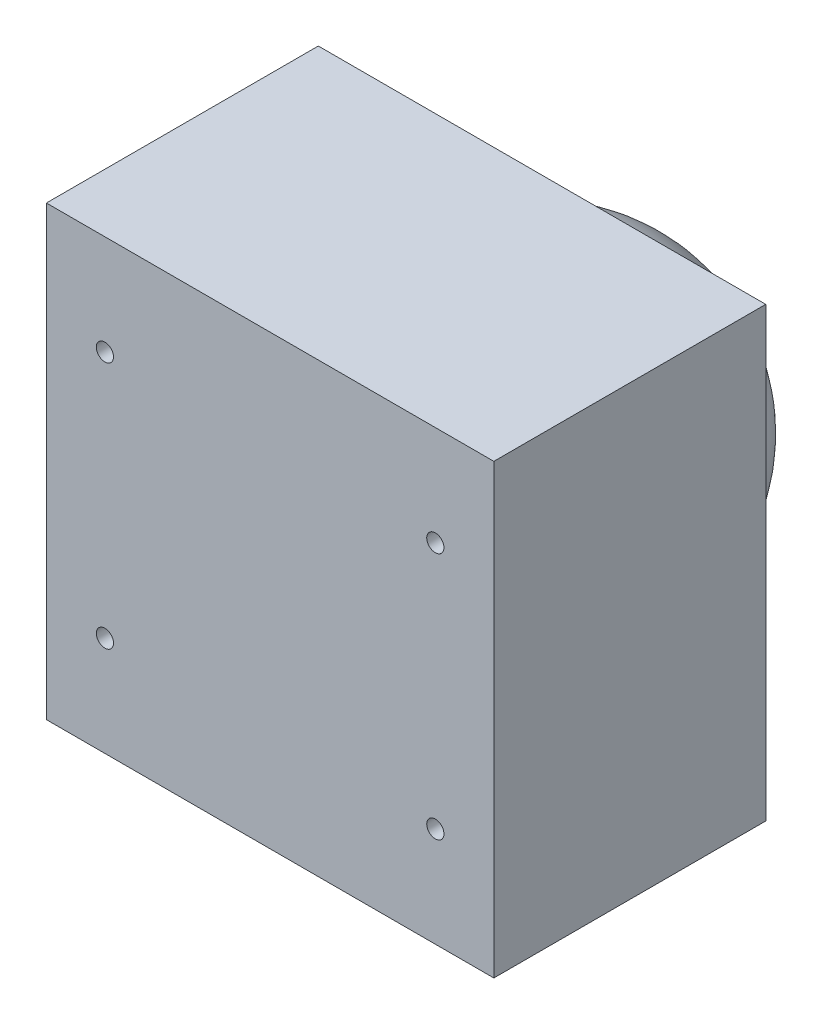
ISO-10303-21;
HEADER;
FILE_DESCRIPTION(('STEP AP214'),'2;1');
FILE_NAME('part.step','',(''),(''),'','','');
FILE_SCHEMA(('AUTOMOTIVE_DESIGN { 1 0 10303 214 1 1 1 1 }'));
ENDSEC;
DATA;
#1=APPLICATION_CONTEXT('core data for automotive mechanical design processes');
#2=APPLICATION_PROTOCOL_DEFINITION('international standard','automotive_design',2000,#1);
#3=PRODUCT_CONTEXT('',#1,'mechanical');
#4=PRODUCT('Part','Part','',(#3));
#5=PRODUCT_RELATED_PRODUCT_CATEGORY('part','',(#4));
#6=PRODUCT_DEFINITION_FORMATION('','',#4);
#7=PRODUCT_DEFINITION_CONTEXT('part definition',#1,'design');
#8=PRODUCT_DEFINITION('design','',#6,#7);
#9=PRODUCT_DEFINITION_SHAPE('','',#8);
#10=(LENGTH_UNIT() NAMED_UNIT(*) SI_UNIT(.MILLI.,.METRE.));
#11=(NAMED_UNIT(*) PLANE_ANGLE_UNIT() SI_UNIT($,.RADIAN.));
#12=(NAMED_UNIT(*) SI_UNIT($,.STERADIAN.) SOLID_ANGLE_UNIT());
#13=UNCERTAINTY_MEASURE_WITH_UNIT(LENGTH_MEASURE(1.E-05),#10,'distance_accuracy_value','');
#14=(GEOMETRIC_REPRESENTATION_CONTEXT(3) GLOBAL_UNCERTAINTY_ASSIGNED_CONTEXT((#13)) GLOBAL_UNIT_ASSIGNED_CONTEXT((#10,
#11,#12)) REPRESENTATION_CONTEXT('',''));
#15=CARTESIAN_POINT('',(0.,0.,0.));
#16=DIRECTION('',(0.,0.,1.));
#17=DIRECTION('',(1.,0.,0.));
#18=AXIS2_PLACEMENT_3D('',#15,#16,#17);
#19=CARTESIAN_POINT('',(32.5,32.5,39.5));
#20=DIRECTION('',(-1.,0.,0.));
#21=DIRECTION('',(0.,-1.,0.));
#22=AXIS2_PLACEMENT_3D('',#19,#20,#21);
#23=PLANE('',#22);
#24=DIRECTION('',(0.,1.,0.));
#25=VECTOR('',#24,1.);
#26=CARTESIAN_POINT('',(32.5,32.5,0.));
#27=LINE('',#26,#25);
#28=CARTESIAN_POINT('',(32.5,-32.5,0.));
#29=VERTEX_POINT('',#28);
#30=CARTESIAN_POINT('',(32.5,32.5,0.));
#31=VERTEX_POINT('',#30);
#32=EDGE_CURVE('E147',#29,#31,#27,.T.);
#33=ORIENTED_EDGE('',*,*,#32,.T.);
#34=DIRECTION('',(0.,0.,-1.));
#35=VECTOR('',#34,1.);
#36=CARTESIAN_POINT('',(32.5,32.5,39.5));
#37=LINE('',#36,#35);
#38=CARTESIAN_POINT('',(32.5,32.5,39.5));
#39=VERTEX_POINT('',#38);
#40=EDGE_CURVE('E46',#39,#31,#37,.T.);
#41=ORIENTED_EDGE('',*,*,#40,.F.);
#42=DIRECTION('',(0.,1.,0.));
#43=VECTOR('',#42,1.);
#44=CARTESIAN_POINT('',(32.5,32.5,39.5));
#45=LINE('',#44,#43);
#46=CARTESIAN_POINT('',(32.5,-32.5,39.5));
#47=VERTEX_POINT('',#46);
#48=EDGE_CURVE('E148',#47,#39,#45,.T.);
#49=ORIENTED_EDGE('',*,*,#48,.F.);
#50=DIRECTION('',(0.,0.,-1.));
#51=VECTOR('',#50,1.);
#52=CARTESIAN_POINT('',(32.5,-32.5,39.5));
#53=LINE('',#52,#51);
#54=EDGE_CURVE('E154',#47,#29,#53,.T.);
#55=ORIENTED_EDGE('',*,*,#54,.T.);
#56=EDGE_LOOP('',(#33,#41,#49,#55));
#57=FACE_BOUND('',#56,.T.);
#58=ADVANCED_FACE('F43',(#57),#23,.F.);
#59=CARTESIAN_POINT('',(-32.5,32.5,39.5));
#60=DIRECTION('',(0.,-1.,0.));
#61=DIRECTION('',(0.,0.,-1.));
#62=AXIS2_PLACEMENT_3D('',#59,#60,#61);
#63=PLANE('',#62);
#64=DIRECTION('',(-1.,0.,0.));
#65=VECTOR('',#64,1.);
#66=CARTESIAN_POINT('',(-32.5,32.5,0.));
#67=LINE('',#66,#65);
#68=CARTESIAN_POINT('',(-32.5,32.5,0.));
#69=VERTEX_POINT('',#68);
#70=EDGE_CURVE('E157',#31,#69,#67,.T.);
#71=ORIENTED_EDGE('',*,*,#70,.T.);
#72=DIRECTION('',(0.,0.,-1.));
#73=VECTOR('',#72,1.);
#74=CARTESIAN_POINT('',(-32.5,32.5,39.5));
#75=LINE('',#74,#73);
#76=CARTESIAN_POINT('',(-32.5,32.5,39.5));
#77=VERTEX_POINT('',#76);
#78=EDGE_CURVE('E163',#77,#69,#75,.T.);
#79=ORIENTED_EDGE('',*,*,#78,.F.);
#80=DIRECTION('',(-1.,0.,0.));
#81=VECTOR('',#80,1.);
#82=CARTESIAN_POINT('',(-32.5,32.5,39.5));
#83=LINE('',#82,#81);
#84=EDGE_CURVE('E92',#39,#77,#83,.T.);
#85=ORIENTED_EDGE('',*,*,#84,.F.);
#86=ORIENTED_EDGE('',*,*,#40,.T.);
#87=EDGE_LOOP('',(#71,#79,#85,#86));
#88=FACE_BOUND('',#87,.T.);
#89=ADVANCED_FACE('F166',(#88),#63,.F.);
#90=CARTESIAN_POINT('',(-32.5,32.5,39.5));
#91=DIRECTION('',(1.,0.,0.));
#92=DIRECTION('',(0.,1.,0.));
#93=AXIS2_PLACEMENT_3D('',#90,#91,#92);
#94=PLANE('',#93);
#95=CARTESIAN_POINT('',(-32.5,0.,25.2));
#96=DIRECTION('',(-1.,0.,0.));
#97=DIRECTION('',(0.,-1.,0.));
#98=AXIS2_PLACEMENT_3D('',#95,#96,#97);
#99=CIRCLE('',#98,6.);
#100=CARTESIAN_POINT('',(-32.5,-6.,25.2));
#101=VERTEX_POINT('',#100);
#102=EDGE_CURVE('E11',#101,#101,#99,.T.);
#103=ORIENTED_EDGE('',*,*,#102,.F.);
#104=EDGE_LOOP('',(#103));
#105=FACE_BOUND('',#104,.T.);
#106=DIRECTION('',(0.,-1.,0.));
#107=VECTOR('',#106,1.);
#108=CARTESIAN_POINT('',(-32.5,32.5,0.));
#109=LINE('',#108,#107);
#110=CARTESIAN_POINT('',(-32.5,-32.5,0.));
#111=VERTEX_POINT('',#110);
#112=EDGE_CURVE('E78',#69,#111,#109,.T.);
#113=ORIENTED_EDGE('',*,*,#112,.T.);
#114=DIRECTION('',(0.,0.,-1.));
#115=VECTOR('',#114,1.);
#116=CARTESIAN_POINT('',(-32.5,-32.5,39.5));
#117=LINE('',#116,#115);
#118=CARTESIAN_POINT('',(-32.5,-32.5,39.5));
#119=VERTEX_POINT('',#118);
#120=EDGE_CURVE('E162',#119,#111,#117,.T.);
#121=ORIENTED_EDGE('',*,*,#120,.F.);
#122=DIRECTION('',(0.,-1.,0.));
#123=VECTOR('',#122,1.);
#124=CARTESIAN_POINT('',(-32.5,32.5,39.5));
#125=LINE('',#124,#123);
#126=EDGE_CURVE('E151',#77,#119,#125,.T.);
#127=ORIENTED_EDGE('',*,*,#126,.F.);
#128=ORIENTED_EDGE('',*,*,#78,.T.);
#129=EDGE_LOOP('',(#113,#121,#127,#128));
#130=FACE_BOUND('',#129,.T.);
#131=ADVANCED_FACE('F192',(#105,#130),#94,.F.);
#132=CARTESIAN_POINT('',(-32.5,-32.5,39.5));
#133=DIRECTION('',(0.,1.,0.));
#134=DIRECTION('',(0.,0.,1.));
#135=AXIS2_PLACEMENT_3D('',#132,#133,#134);
#136=PLANE('',#135);
#137=DIRECTION('',(1.,0.,0.));
#138=VECTOR('',#137,1.);
#139=CARTESIAN_POINT('',(-32.5,-32.5,0.));
#140=LINE('',#139,#138);
#141=EDGE_CURVE('E84',#111,#29,#140,.T.);
#142=ORIENTED_EDGE('',*,*,#141,.T.);
#143=ORIENTED_EDGE('',*,*,#54,.F.);
#144=DIRECTION('',(1.,0.,0.));
#145=VECTOR('',#144,1.);
#146=CARTESIAN_POINT('',(-32.5,-32.5,39.5));
#147=LINE('',#146,#145);
#148=EDGE_CURVE('E60',#119,#47,#147,.T.);
#149=ORIENTED_EDGE('',*,*,#148,.F.);
#150=ORIENTED_EDGE('',*,*,#120,.T.);
#151=EDGE_LOOP('',(#142,#143,#149,#150));
#152=FACE_BOUND('',#151,.T.);
#153=ADVANCED_FACE('F184',(#152),#136,.F.);
#154=CARTESIAN_POINT('',(0.,0.,39.5));
#155=DIRECTION('',(0.,0.,1.));
#156=DIRECTION('',(1.,0.,0.));
#157=AXIS2_PLACEMENT_3D('',#154,#155,#156);
#158=PLANE('',#157);
#159=CARTESIAN_POINT('',(-24.,18.,39.5));
#160=DIRECTION('',(0.,0.,1.));
#161=DIRECTION('',(1.,0.,0.));
#162=AXIS2_PLACEMENT_3D('',#159,#160,#161);
#163=CIRCLE('',#162,1.25);
#164=CARTESIAN_POINT('',(-22.75,18.,39.5));
#165=VERTEX_POINT('',#164);
#166=EDGE_CURVE('E116',#165,#165,#163,.T.);
#167=ORIENTED_EDGE('',*,*,#166,.F.);
#168=EDGE_LOOP('',(#167));
#169=FACE_BOUND('',#168,.T.);
#170=CARTESIAN_POINT('',(-24.,-18.,39.5));
#171=DIRECTION('',(0.,0.,1.));
#172=DIRECTION('',(1.,0.,0.));
#173=AXIS2_PLACEMENT_3D('',#170,#171,#172);
#174=CIRCLE('',#173,1.25);
#175=CARTESIAN_POINT('',(-22.75,-18.,39.5));
#176=VERTEX_POINT('',#175);
#177=EDGE_CURVE('E115',#176,#176,#174,.T.);
#178=ORIENTED_EDGE('',*,*,#177,.F.);
#179=EDGE_LOOP('',(#178));
#180=FACE_BOUND('',#179,.T.);
#181=CARTESIAN_POINT('',(24.,18.,39.5));
#182=DIRECTION('',(0.,0.,1.));
#183=DIRECTION('',(1.,0.,0.));
#184=AXIS2_PLACEMENT_3D('',#181,#182,#183);
#185=CIRCLE('',#184,1.25);
#186=CARTESIAN_POINT('',(25.25,18.,39.5));
#187=VERTEX_POINT('',#186);
#188=EDGE_CURVE('E126',#187,#187,#185,.T.);
#189=ORIENTED_EDGE('',*,*,#188,.F.);
#190=EDGE_LOOP('',(#189));
#191=FACE_BOUND('',#190,.T.);
#192=CARTESIAN_POINT('',(24.,-18.,39.5));
#193=DIRECTION('',(0.,0.,1.));
#194=DIRECTION('',(1.,0.,0.));
#195=AXIS2_PLACEMENT_3D('',#192,#193,#194);
#196=CIRCLE('',#195,1.25);
#197=CARTESIAN_POINT('',(25.25,-18.,39.5));
#198=VERTEX_POINT('',#197);
#199=EDGE_CURVE('E132',#198,#198,#196,.T.);
#200=ORIENTED_EDGE('',*,*,#199,.F.);
#201=EDGE_LOOP('',(#200));
#202=FACE_BOUND('',#201,.T.);
#203=ORIENTED_EDGE('',*,*,#48,.T.);
#204=ORIENTED_EDGE('',*,*,#84,.T.);
#205=ORIENTED_EDGE('',*,*,#126,.T.);
#206=ORIENTED_EDGE('',*,*,#148,.T.);
#207=EDGE_LOOP('',(#203,#204,#205,#206));
#208=FACE_BOUND('',#207,.T.);
#209=ADVANCED_FACE('F174',(#169,#180,#191,#202,#208),#158,.T.);
#210=CARTESIAN_POINT('',(0.,0.,0.));
#211=DIRECTION('',(0.,0.,1.));
#212=DIRECTION('',(1.,0.,0.));
#213=AXIS2_PLACEMENT_3D('',#210,#211,#212);
#214=PLANE('',#213);
#215=CARTESIAN_POINT('',(0.,0.,0.));
#216=DIRECTION('',(0.,0.,1.));
#217=DIRECTION('',(1.,0.,0.));
#218=AXIS2_PLACEMENT_3D('',#215,#216,#217);
#219=CIRCLE('',#218,24.);
#220=CARTESIAN_POINT('',(24.,0.,0.));
#221=VERTEX_POINT('',#220);
#222=EDGE_CURVE('E144',#221,#221,#219,.T.);
#223=ORIENTED_EDGE('',*,*,#222,.T.);
#224=EDGE_LOOP('',(#223));
#225=FACE_BOUND('',#224,.T.);
#226=ORIENTED_EDGE('',*,*,#32,.F.);
#227=ORIENTED_EDGE('',*,*,#141,.F.);
#228=ORIENTED_EDGE('',*,*,#112,.F.);
#229=ORIENTED_EDGE('',*,*,#70,.F.);
#230=EDGE_LOOP('',(#226,#227,#228,#229));
#231=FACE_BOUND('',#230,.T.);
#232=ADVANCED_FACE('F171',(#225,#231),#214,.F.);
#233=CARTESIAN_POINT('',(0.,0.,0.));
#234=DIRECTION('',(0.,0.,1.));
#235=DIRECTION('',(1.,0.,0.));
#236=AXIS2_PLACEMENT_3D('',#233,#234,#235);
#237=SPHERICAL_SURFACE('',#236,24.);
#238=CARTESIAN_POINT('',(0.,0.,-20.5));
#239=DIRECTION('',(0.,0.,1.));
#240=DIRECTION('',(1.,0.,0.));
#241=AXIS2_PLACEMENT_3D('',#238,#239,#240);
#242=CIRCLE('',#241,12.4799839743487);
#243=CARTESIAN_POINT('',(12.4799839743487,0.,-20.5));
#244=VERTEX_POINT('',#243);
#245=EDGE_CURVE('E140',#244,#244,#242,.T.);
#246=ORIENTED_EDGE('',*,*,#245,.T.);
#247=EDGE_LOOP('',(#246));
#248=FACE_BOUND('',#247,.T.);
#249=ORIENTED_EDGE('',*,*,#222,.F.);
#250=EDGE_LOOP('',(#249));
#251=FACE_BOUND('',#250,.T.);
#252=ADVANCED_FACE('F173',(#248,#251),#237,.T.);
#253=CARTESIAN_POINT('',(0.,0.,-20.5));
#254=DIRECTION('',(0.,0.,-1.));
#255=DIRECTION('',(-1.,0.,0.));
#256=AXIS2_PLACEMENT_3D('',#253,#254,#255);
#257=PLANE('',#256);
#258=ORIENTED_EDGE('',*,*,#245,.F.);
#259=EDGE_LOOP('',(#258));
#260=FACE_BOUND('',#259,.T.);
#261=ADVANCED_FACE('F181',(#260),#257,.T.);
#262=CARTESIAN_POINT('',(-39.5,0.,25.2));
#263=DIRECTION('',(1.,0.,0.));
#264=DIRECTION('',(0.,1.,0.));
#265=AXIS2_PLACEMENT_3D('',#262,#263,#264);
#266=CYLINDRICAL_SURFACE('',#265,6.);
#267=CARTESIAN_POINT('',(-39.5,0.,25.2));
#268=DIRECTION('',(-1.,0.,0.));
#269=DIRECTION('',(0.,-1.,0.));
#270=AXIS2_PLACEMENT_3D('',#267,#268,#269);
#271=CIRCLE('',#270,6.);
#272=CARTESIAN_POINT('',(-39.5,-6.,25.2));
#273=VERTEX_POINT('',#272);
#274=EDGE_CURVE('E138',#273,#273,#271,.T.);
#275=ORIENTED_EDGE('',*,*,#274,.F.);
#276=EDGE_LOOP('',(#275));
#277=FACE_BOUND('',#276,.T.);
#278=ORIENTED_EDGE('',*,*,#102,.T.);
#279=EDGE_LOOP('',(#278));
#280=FACE_BOUND('',#279,.T.);
#281=ADVANCED_FACE('F300',(#277,#280),#266,.T.);
#282=CARTESIAN_POINT('',(-39.5,0.,25.2));
#283=DIRECTION('',(-1.,0.,0.));
#284=DIRECTION('',(0.,-1.,0.));
#285=AXIS2_PLACEMENT_3D('',#282,#283,#284);
#286=PLANE('',#285);
#287=ORIENTED_EDGE('',*,*,#274,.T.);
#288=EDGE_LOOP('',(#287));
#289=FACE_BOUND('',#288,.T.);
#290=ADVANCED_FACE('F310',(#289),#286,.T.);
#291=CARTESIAN_POINT('',(24.,-18.,35.2510757737844));
#292=DIRECTION('',(0.,0.,1.));
#293=DIRECTION('',(1.,0.,0.));
#294=AXIS2_PLACEMENT_3D('',#291,#292,#293);
#295=CONICAL_SURFACE('',#294,1.25,1.02974425867666);
#296=CARTESIAN_POINT('',(24.,-18.,34.5));
#297=VERTEX_POINT('',#296);
#298=VERTEX_LOOP('',#297);
#299=FACE_BOUND('',#298,.T.);
#300=CARTESIAN_POINT('',(24.,-18.,35.2510757737844));
#301=DIRECTION('',(0.,0.,1.));
#302=DIRECTION('',(1.,0.,0.));
#303=AXIS2_PLACEMENT_3D('',#300,#301,#302);
#304=CIRCLE('',#303,1.25);
#305=CARTESIAN_POINT('',(25.25,-18.,35.2510757737844));
#306=VERTEX_POINT('',#305);
#307=EDGE_CURVE('E135',#306,#306,#304,.T.);
#308=ORIENTED_EDGE('',*,*,#307,.T.);
#309=EDGE_LOOP('',(#308));
#310=FACE_BOUND('',#309,.T.);
#311=ADVANCED_FACE('F223',(#299,#310),#295,.F.);
#312=CARTESIAN_POINT('',(24.,-18.,39.5));
#313=DIRECTION('',(0.,0.,1.));
#314=DIRECTION('',(1.,0.,0.));
#315=AXIS2_PLACEMENT_3D('',#312,#313,#314);
#316=CYLINDRICAL_SURFACE('',#315,1.25);
#317=ORIENTED_EDGE('',*,*,#307,.F.);
#318=EDGE_LOOP('',(#317));
#319=FACE_BOUND('',#318,.T.);
#320=ORIENTED_EDGE('',*,*,#199,.T.);
#321=EDGE_LOOP('',(#320));
#322=FACE_BOUND('',#321,.T.);
#323=ADVANCED_FACE('F217',(#319,#322),#316,.F.);
#324=CARTESIAN_POINT('',(24.,18.,35.2510757737844));
#325=DIRECTION('',(0.,0.,1.));
#326=DIRECTION('',(1.,0.,0.));
#327=AXIS2_PLACEMENT_3D('',#324,#325,#326);
#328=CONICAL_SURFACE('',#327,1.25,1.02974425867666);
#329=CARTESIAN_POINT('',(24.,18.,34.5));
#330=VERTEX_POINT('',#329);
#331=VERTEX_LOOP('',#330);
#332=FACE_BOUND('',#331,.T.);
#333=CARTESIAN_POINT('',(24.,18.,35.2510757737844));
#334=DIRECTION('',(0.,0.,1.));
#335=DIRECTION('',(1.,0.,0.));
#336=AXIS2_PLACEMENT_3D('',#333,#334,#335);
#337=CIRCLE('',#336,1.25);
#338=CARTESIAN_POINT('',(25.25,18.,35.2510757737844));
#339=VERTEX_POINT('',#338);
#340=EDGE_CURVE('E129',#339,#339,#337,.T.);
#341=ORIENTED_EDGE('',*,*,#340,.T.);
#342=EDGE_LOOP('',(#341));
#343=FACE_BOUND('',#342,.T.);
#344=ADVANCED_FACE('F222',(#332,#343),#328,.F.);
#345=CARTESIAN_POINT('',(24.,18.,39.5));
#346=DIRECTION('',(0.,0.,1.));
#347=DIRECTION('',(1.,0.,0.));
#348=AXIS2_PLACEMENT_3D('',#345,#346,#347);
#349=CYLINDRICAL_SURFACE('',#348,1.25);
#350=ORIENTED_EDGE('',*,*,#340,.F.);
#351=EDGE_LOOP('',(#350));
#352=FACE_BOUND('',#351,.T.);
#353=ORIENTED_EDGE('',*,*,#188,.T.);
#354=EDGE_LOOP('',(#353));
#355=FACE_BOUND('',#354,.T.);
#356=ADVANCED_FACE('F232',(#352,#355),#349,.F.);
#357=CARTESIAN_POINT('',(-24.,-18.,35.2510757737844));
#358=DIRECTION('',(0.,0.,1.));
#359=DIRECTION('',(1.,0.,0.));
#360=AXIS2_PLACEMENT_3D('',#357,#358,#359);
#361=CONICAL_SURFACE('',#360,1.25,1.02974425867666);
#362=CARTESIAN_POINT('',(-24.,-18.,34.5));
#363=VERTEX_POINT('',#362);
#364=VERTEX_LOOP('',#363);
#365=FACE_BOUND('',#364,.T.);
#366=CARTESIAN_POINT('',(-24.,-18.,35.2510757737844));
#367=DIRECTION('',(0.,0.,1.));
#368=DIRECTION('',(1.,0.,0.));
#369=AXIS2_PLACEMENT_3D('',#366,#367,#368);
#370=CIRCLE('',#369,1.25);
#371=CARTESIAN_POINT('',(-22.75,-18.,35.2510757737844));
#372=VERTEX_POINT('',#371);
#373=EDGE_CURVE('E119',#372,#372,#370,.T.);
#374=ORIENTED_EDGE('',*,*,#373,.T.);
#375=EDGE_LOOP('',(#374));
#376=FACE_BOUND('',#375,.T.);
#377=ADVANCED_FACE('F237',(#365,#376),#361,.F.);
#378=CARTESIAN_POINT('',(-24.,-18.,39.5));
#379=DIRECTION('',(0.,0.,1.));
#380=DIRECTION('',(1.,0.,0.));
#381=AXIS2_PLACEMENT_3D('',#378,#379,#380);
#382=CYLINDRICAL_SURFACE('',#381,1.25);
#383=ORIENTED_EDGE('',*,*,#373,.F.);
#384=EDGE_LOOP('',(#383));
#385=FACE_BOUND('',#384,.T.);
#386=ORIENTED_EDGE('',*,*,#177,.T.);
#387=EDGE_LOOP('',(#386));
#388=FACE_BOUND('',#387,.T.);
#389=ADVANCED_FACE('F109',(#385,#388),#382,.F.);
#390=CARTESIAN_POINT('',(-24.,18.,35.2510757737844));
#391=DIRECTION('',(0.,0.,1.));
#392=DIRECTION('',(1.,0.,0.));
#393=AXIS2_PLACEMENT_3D('',#390,#391,#392);
#394=CONICAL_SURFACE('',#393,1.25,1.02974425867666);
#395=CARTESIAN_POINT('',(-24.,18.,34.5));
#396=VERTEX_POINT('',#395);
#397=VERTEX_LOOP('',#396);
#398=FACE_BOUND('',#397,.T.);
#399=CARTESIAN_POINT('',(-24.,18.,35.2510757737844));
#400=DIRECTION('',(0.,0.,1.));
#401=DIRECTION('',(1.,0.,0.));
#402=AXIS2_PLACEMENT_3D('',#399,#400,#401);
#403=CIRCLE('',#402,1.25);
#404=CARTESIAN_POINT('',(-22.75,18.,35.2510757737844));
#405=VERTEX_POINT('',#404);
#406=EDGE_CURVE('E113',#405,#405,#403,.T.);
#407=ORIENTED_EDGE('',*,*,#406,.T.);
#408=EDGE_LOOP('',(#407));
#409=FACE_BOUND('',#408,.T.);
#410=ADVANCED_FACE('F105',(#398,#409),#394,.F.);
#411=CARTESIAN_POINT('',(-24.,18.,39.5));
#412=DIRECTION('',(0.,0.,1.));
#413=DIRECTION('',(1.,0.,0.));
#414=AXIS2_PLACEMENT_3D('',#411,#412,#413);
#415=CYLINDRICAL_SURFACE('',#414,1.25);
#416=ORIENTED_EDGE('',*,*,#406,.F.);
#417=EDGE_LOOP('',(#416));
#418=FACE_BOUND('',#417,.T.);
#419=ORIENTED_EDGE('',*,*,#166,.T.);
#420=EDGE_LOOP('',(#419));
#421=FACE_BOUND('',#420,.T.);
#422=ADVANCED_FACE('F108',(#418,#421),#415,.F.);
#423=CLOSED_SHELL('',(#58,#89,#131,#153,#209,#232,#252,#261,#281,#290,#311,#323,#344,#356,#377,
#389,#410,#422));
#424=MANIFOLD_SOLID_BREP('B2',#423);
#425=ADVANCED_BREP_SHAPE_REPRESENTATION('',(#18,#424),#14);
#426=SHAPE_DEFINITION_REPRESENTATION(#9,#425);
ENDSEC;
END-ISO-10303-21;
